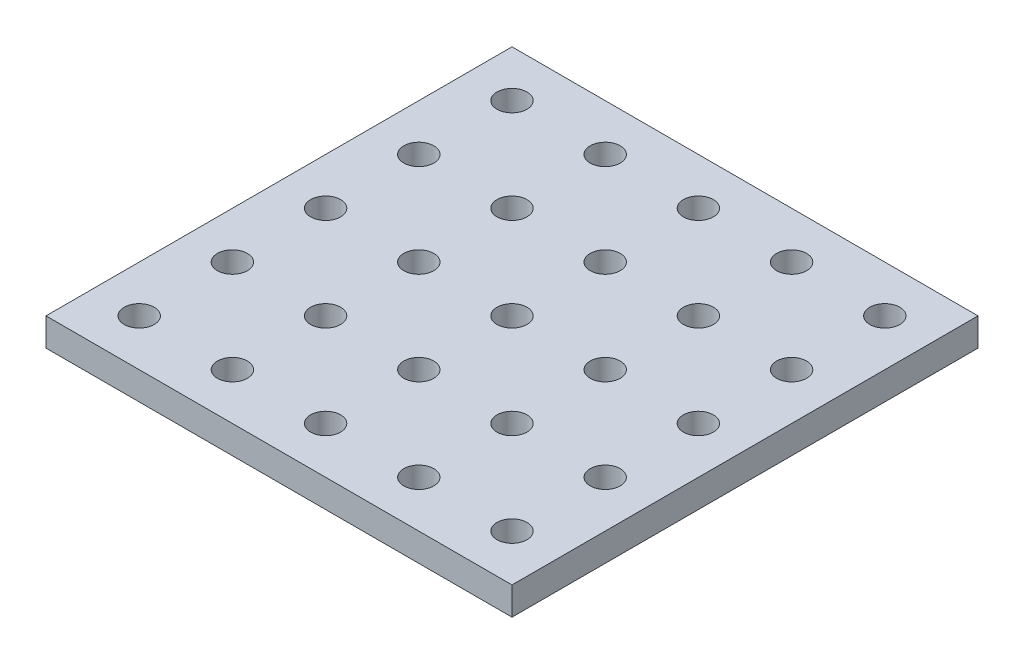
ISO-10303-21;
HEADER;
FILE_DESCRIPTION(('STEP AP214'),'2;1');
FILE_NAME('part.step','',(''),(''),'','','');
FILE_SCHEMA(('AUTOMOTIVE_DESIGN { 1 0 10303 214 1 1 1 1 }'));
ENDSEC;
DATA;
#1=APPLICATION_CONTEXT('core data for automotive mechanical design processes');
#2=APPLICATION_PROTOCOL_DEFINITION('international standard','automotive_design',2000,#1);
#3=PRODUCT_CONTEXT('',#1,'mechanical');
#4=PRODUCT('Part','Part','',(#3));
#5=PRODUCT_RELATED_PRODUCT_CATEGORY('part','',(#4));
#6=PRODUCT_DEFINITION_FORMATION('','',#4);
#7=PRODUCT_DEFINITION_CONTEXT('part definition',#1,'design');
#8=PRODUCT_DEFINITION('design','',#6,#7);
#9=PRODUCT_DEFINITION_SHAPE('','',#8);
#10=(LENGTH_UNIT() NAMED_UNIT(*) SI_UNIT(.MILLI.,.METRE.));
#11=(NAMED_UNIT(*) PLANE_ANGLE_UNIT() SI_UNIT($,.RADIAN.));
#12=(NAMED_UNIT(*) SI_UNIT($,.STERADIAN.) SOLID_ANGLE_UNIT());
#13=UNCERTAINTY_MEASURE_WITH_UNIT(LENGTH_MEASURE(1.E-05),#10,'distance_accuracy_value','');
#14=(GEOMETRIC_REPRESENTATION_CONTEXT(3) GLOBAL_UNCERTAINTY_ASSIGNED_CONTEXT((#13)) GLOBAL_UNIT_ASSIGNED_CONTEXT((#10,
#11,#12)) REPRESENTATION_CONTEXT('',''));
#15=CARTESIAN_POINT('',(0.,0.,0.));
#16=DIRECTION('',(0.,0.,1.));
#17=DIRECTION('',(1.,0.,0.));
#18=AXIS2_PLACEMENT_3D('',#15,#16,#17);
#19=CARTESIAN_POINT('',(-125.,15.,-125.));
#20=DIRECTION('',(1.,0.,0.));
#21=DIRECTION('',(0.,0.,-1.));
#22=AXIS2_PLACEMENT_3D('',#19,#20,#21);
#23=PLANE('',#22);
#24=DIRECTION('',(0.,0.,1.));
#25=VECTOR('',#24,1.);
#26=CARTESIAN_POINT('',(-125.,0.,-125.));
#27=LINE('',#26,#25);
#28=CARTESIAN_POINT('',(-125.,0.,-125.));
#29=VERTEX_POINT('',#28);
#30=CARTESIAN_POINT('',(-125.,0.,125.));
#31=VERTEX_POINT('',#30);
#32=EDGE_CURVE('E107',#29,#31,#27,.T.);
#33=ORIENTED_EDGE('',*,*,#32,.T.);
#34=DIRECTION('',(0.,-1.,0.));
#35=VECTOR('',#34,1.);
#36=CARTESIAN_POINT('',(-125.,15.,125.));
#37=LINE('',#36,#35);
#38=CARTESIAN_POINT('',(-125.,15.,125.));
#39=VERTEX_POINT('',#38);
#40=EDGE_CURVE('E11',#39,#31,#37,.T.);
#41=ORIENTED_EDGE('',*,*,#40,.F.);
#42=DIRECTION('',(0.,0.,1.));
#43=VECTOR('',#42,1.);
#44=CARTESIAN_POINT('',(-125.,15.,-125.));
#45=LINE('',#44,#43);
#46=CARTESIAN_POINT('',(-125.,15.,-125.));
#47=VERTEX_POINT('',#46);
#48=EDGE_CURVE('E91',#47,#39,#45,.T.);
#49=ORIENTED_EDGE('',*,*,#48,.F.);
#50=DIRECTION('',(0.,-1.,0.));
#51=VECTOR('',#50,1.);
#52=CARTESIAN_POINT('',(-125.,15.,-125.));
#53=LINE('',#52,#51);
#54=EDGE_CURVE('E103',#47,#29,#53,.T.);
#55=ORIENTED_EDGE('',*,*,#54,.T.);
#56=EDGE_LOOP('',(#33,#41,#49,#55));
#57=FACE_BOUND('',#56,.T.);
#58=ADVANCED_FACE('F39',(#57),#23,.F.);
#59=CARTESIAN_POINT('',(-125.,15.,125.));
#60=DIRECTION('',(0.,0.,-1.));
#61=DIRECTION('',(-1.,0.,0.));
#62=AXIS2_PLACEMENT_3D('',#59,#60,#61);
#63=PLANE('',#62);
#64=DIRECTION('',(1.,0.,0.));
#65=VECTOR('',#64,1.);
#66=CARTESIAN_POINT('',(-125.,0.,125.));
#67=LINE('',#66,#65);
#68=CARTESIAN_POINT('',(125.,0.,125.));
#69=VERTEX_POINT('',#68);
#70=EDGE_CURVE('E96',#31,#69,#67,.T.);
#71=ORIENTED_EDGE('',*,*,#70,.T.);
#72=DIRECTION('',(0.,-1.,0.));
#73=VECTOR('',#72,1.);
#74=CARTESIAN_POINT('',(125.,15.,125.));
#75=LINE('',#74,#73);
#76=CARTESIAN_POINT('',(125.,15.,125.));
#77=VERTEX_POINT('',#76);
#78=EDGE_CURVE('E48',#77,#69,#75,.T.);
#79=ORIENTED_EDGE('',*,*,#78,.F.);
#80=DIRECTION('',(1.,0.,0.));
#81=VECTOR('',#80,1.);
#82=CARTESIAN_POINT('',(-125.,15.,125.));
#83=LINE('',#82,#81);
#84=EDGE_CURVE('E86',#39,#77,#83,.T.);
#85=ORIENTED_EDGE('',*,*,#84,.F.);
#86=ORIENTED_EDGE('',*,*,#40,.T.);
#87=EDGE_LOOP('',(#71,#79,#85,#86));
#88=FACE_BOUND('',#87,.T.);
#89=ADVANCED_FACE('F95',(#88),#63,.F.);
#90=CARTESIAN_POINT('',(125.,15.,-125.));
#91=DIRECTION('',(-1.,0.,0.));
#92=DIRECTION('',(0.,0.,1.));
#93=AXIS2_PLACEMENT_3D('',#90,#91,#92);
#94=PLANE('',#93);
#95=DIRECTION('',(0.,0.,-1.));
#96=VECTOR('',#95,1.);
#97=CARTESIAN_POINT('',(125.,0.,-125.));
#98=LINE('',#97,#96);
#99=CARTESIAN_POINT('',(125.,0.,-125.));
#100=VERTEX_POINT('',#99);
#101=EDGE_CURVE('E73',#69,#100,#98,.T.);
#102=ORIENTED_EDGE('',*,*,#101,.T.);
#103=DIRECTION('',(0.,-1.,0.));
#104=VECTOR('',#103,1.);
#105=CARTESIAN_POINT('',(125.,15.,-125.));
#106=LINE('',#105,#104);
#107=CARTESIAN_POINT('',(125.,15.,-125.));
#108=VERTEX_POINT('',#107);
#109=EDGE_CURVE('E98',#108,#100,#106,.T.);
#110=ORIENTED_EDGE('',*,*,#109,.F.);
#111=DIRECTION('',(0.,0.,-1.));
#112=VECTOR('',#111,1.);
#113=CARTESIAN_POINT('',(125.,15.,-125.));
#114=LINE('',#113,#112);
#115=EDGE_CURVE('E89',#77,#108,#114,.T.);
#116=ORIENTED_EDGE('',*,*,#115,.F.);
#117=ORIENTED_EDGE('',*,*,#78,.T.);
#118=EDGE_LOOP('',(#102,#110,#116,#117));
#119=FACE_BOUND('',#118,.T.);
#120=ADVANCED_FACE('F99',(#119),#94,.F.);
#121=CARTESIAN_POINT('',(-125.,15.,-125.));
#122=DIRECTION('',(0.,0.,1.));
#123=DIRECTION('',(1.,0.,0.));
#124=AXIS2_PLACEMENT_3D('',#121,#122,#123);
#125=PLANE('',#124);
#126=DIRECTION('',(-1.,0.,0.));
#127=VECTOR('',#126,1.);
#128=CARTESIAN_POINT('',(-125.,0.,-125.));
#129=LINE('',#128,#127);
#130=EDGE_CURVE('E79',#100,#29,#129,.T.);
#131=ORIENTED_EDGE('',*,*,#130,.T.);
#132=ORIENTED_EDGE('',*,*,#54,.F.);
#133=DIRECTION('',(-1.,0.,0.));
#134=VECTOR('',#133,1.);
#135=CARTESIAN_POINT('',(-125.,15.,-125.));
#136=LINE('',#135,#134);
#137=EDGE_CURVE('E56',#108,#47,#136,.T.);
#138=ORIENTED_EDGE('',*,*,#137,.F.);
#139=ORIENTED_EDGE('',*,*,#109,.T.);
#140=EDGE_LOOP('',(#131,#132,#138,#139));
#141=FACE_BOUND('',#140,.T.);
#142=ADVANCED_FACE('F121',(#141),#125,.F.);
#143=CARTESIAN_POINT('',(0.,15.,0.));
#144=DIRECTION('',(0.,1.,0.));
#145=DIRECTION('',(0.,0.,1.));
#146=AXIS2_PLACEMENT_3D('',#143,#144,#145);
#147=PLANE('',#146);
#148=CARTESIAN_POINT('',(-50.,15.,-100.));
#149=DIRECTION('',(0.,1.,0.));
#150=DIRECTION('',(0.,0.,1.));
#151=AXIS2_PLACEMENT_3D('',#148,#149,#150);
#152=CIRCLE('',#151,8.05);
#153=CARTESIAN_POINT('',(-50.,15.,-91.95));
#154=VERTEX_POINT('',#153);
#155=EDGE_CURVE('E257',#154,#154,#152,.T.);
#156=ORIENTED_EDGE('',*,*,#155,.F.);
#157=EDGE_LOOP('',(#156));
#158=FACE_BOUND('',#157,.T.);
#159=CARTESIAN_POINT('',(0.,15.,-100.));
#160=DIRECTION('',(0.,1.,0.));
#161=DIRECTION('',(0.,0.,1.));
#162=AXIS2_PLACEMENT_3D('',#159,#160,#161);
#163=CIRCLE('',#162,8.05);
#164=CARTESIAN_POINT('',(0.,15.,-91.95));
#165=VERTEX_POINT('',#164);
#166=EDGE_CURVE('E249',#165,#165,#163,.T.);
#167=ORIENTED_EDGE('',*,*,#166,.F.);
#168=EDGE_LOOP('',(#167));
#169=FACE_BOUND('',#168,.T.);
#170=CARTESIAN_POINT('',(50.,15.,-100.));
#171=DIRECTION('',(0.,1.,0.));
#172=DIRECTION('',(0.,0.,1.));
#173=AXIS2_PLACEMENT_3D('',#170,#171,#172);
#174=CIRCLE('',#173,8.05);
#175=CARTESIAN_POINT('',(50.,15.,-91.95));
#176=VERTEX_POINT('',#175);
#177=EDGE_CURVE('E241',#176,#176,#174,.T.);
#178=ORIENTED_EDGE('',*,*,#177,.F.);
#179=EDGE_LOOP('',(#178));
#180=FACE_BOUND('',#179,.T.);
#181=CARTESIAN_POINT('',(100.,15.,-100.));
#182=DIRECTION('',(0.,1.,0.));
#183=DIRECTION('',(0.,0.,1.));
#184=AXIS2_PLACEMENT_3D('',#181,#182,#183);
#185=CIRCLE('',#184,8.05000000000001);
#186=CARTESIAN_POINT('',(100.,15.,-91.95));
#187=VERTEX_POINT('',#186);
#188=EDGE_CURVE('E233',#187,#187,#185,.T.);
#189=ORIENTED_EDGE('',*,*,#188,.F.);
#190=EDGE_LOOP('',(#189));
#191=FACE_BOUND('',#190,.T.);
#192=CARTESIAN_POINT('',(-49.9999999999995,15.,-50.));
#193=DIRECTION('',(0.,1.,0.));
#194=DIRECTION('',(0.,0.,1.));
#195=AXIS2_PLACEMENT_3D('',#192,#193,#194);
#196=CIRCLE('',#195,8.05);
#197=CARTESIAN_POINT('',(-49.9999999999995,15.,-41.95));
#198=VERTEX_POINT('',#197);
#199=EDGE_CURVE('E225',#198,#198,#196,.T.);
#200=ORIENTED_EDGE('',*,*,#199,.F.);
#201=EDGE_LOOP('',(#200));
#202=FACE_BOUND('',#201,.T.);
#203=CARTESIAN_POINT('',(5.55111512312578E-13,15.,-50.));
#204=DIRECTION('',(0.,1.,0.));
#205=DIRECTION('',(0.,0.,1.));
#206=AXIS2_PLACEMENT_3D('',#203,#204,#205);
#207=CIRCLE('',#206,8.05);
#208=CARTESIAN_POINT('',(5.55111512312578E-13,15.,-41.95));
#209=VERTEX_POINT('',#208);
#210=EDGE_CURVE('E217',#209,#209,#207,.T.);
#211=ORIENTED_EDGE('',*,*,#210,.F.);
#212=EDGE_LOOP('',(#211));
#213=FACE_BOUND('',#212,.T.);
#214=CARTESIAN_POINT('',(50.0000000000006,15.,-50.));
#215=DIRECTION('',(0.,1.,0.));
#216=DIRECTION('',(0.,0.,1.));
#217=AXIS2_PLACEMENT_3D('',#214,#215,#216);
#218=CIRCLE('',#217,8.05);
#219=CARTESIAN_POINT('',(50.0000000000006,15.,-41.95));
#220=VERTEX_POINT('',#219);
#221=EDGE_CURVE('E209',#220,#220,#218,.T.);
#222=ORIENTED_EDGE('',*,*,#221,.F.);
#223=EDGE_LOOP('',(#222));
#224=FACE_BOUND('',#223,.T.);
#225=CARTESIAN_POINT('',(100.000000000001,15.,-50.));
#226=DIRECTION('',(0.,1.,0.));
#227=DIRECTION('',(0.,0.,1.));
#228=AXIS2_PLACEMENT_3D('',#225,#226,#227);
#229=CIRCLE('',#228,8.05000000000001);
#230=CARTESIAN_POINT('',(100.000000000001,15.,-41.95));
#231=VERTEX_POINT('',#230);
#232=EDGE_CURVE('E201',#231,#231,#229,.T.);
#233=ORIENTED_EDGE('',*,*,#232,.F.);
#234=EDGE_LOOP('',(#233));
#235=FACE_BOUND('',#234,.T.);
#236=CARTESIAN_POINT('',(-49.9999999999989,15.,0.));
#237=DIRECTION('',(0.,1.,0.));
#238=DIRECTION('',(0.,0.,1.));
#239=AXIS2_PLACEMENT_3D('',#236,#237,#238);
#240=CIRCLE('',#239,8.05);
#241=CARTESIAN_POINT('',(-49.9999999999989,15.,8.05));
#242=VERTEX_POINT('',#241);
#243=EDGE_CURVE('E193',#242,#242,#240,.T.);
#244=ORIENTED_EDGE('',*,*,#243,.F.);
#245=EDGE_LOOP('',(#244));
#246=FACE_BOUND('',#245,.T.);
#247=CARTESIAN_POINT('',(1.06858966120171E-12,15.,0.));
#248=DIRECTION('',(0.,1.,0.));
#249=DIRECTION('',(0.,0.,1.));
#250=AXIS2_PLACEMENT_3D('',#247,#248,#249);
#251=CIRCLE('',#250,8.05);
#252=CARTESIAN_POINT('',(1.06858966120171E-12,15.,8.05));
#253=VERTEX_POINT('',#252);
#254=EDGE_CURVE('E185',#253,#253,#251,.T.);
#255=ORIENTED_EDGE('',*,*,#254,.F.);
#256=EDGE_LOOP('',(#255));
#257=FACE_BOUND('',#256,.T.);
#258=CARTESIAN_POINT('',(50.0000000000011,15.,0.));
#259=DIRECTION('',(0.,1.,0.));
#260=DIRECTION('',(0.,0.,1.));
#261=AXIS2_PLACEMENT_3D('',#258,#259,#260);
#262=CIRCLE('',#261,8.05);
#263=CARTESIAN_POINT('',(50.0000000000011,15.,8.05));
#264=VERTEX_POINT('',#263);
#265=EDGE_CURVE('E177',#264,#264,#262,.T.);
#266=ORIENTED_EDGE('',*,*,#265,.F.);
#267=EDGE_LOOP('',(#266));
#268=FACE_BOUND('',#267,.T.);
#269=CARTESIAN_POINT('',(100.000000000001,15.,0.));
#270=DIRECTION('',(0.,1.,0.));
#271=DIRECTION('',(0.,0.,1.));
#272=AXIS2_PLACEMENT_3D('',#269,#270,#271);
#273=CIRCLE('',#272,8.05000000000001);
#274=CARTESIAN_POINT('',(100.000000000001,15.,8.05000000000001));
#275=VERTEX_POINT('',#274);
#276=EDGE_CURVE('E169',#275,#275,#273,.T.);
#277=ORIENTED_EDGE('',*,*,#276,.F.);
#278=EDGE_LOOP('',(#277));
#279=FACE_BOUND('',#278,.T.);
#280=CARTESIAN_POINT('',(-49.9999999999984,15.,50.));
#281=DIRECTION('',(0.,1.,0.));
#282=DIRECTION('',(0.,0.,1.));
#283=AXIS2_PLACEMENT_3D('',#280,#281,#282);
#284=CIRCLE('',#283,8.05);
#285=CARTESIAN_POINT('',(-49.9999999999984,15.,58.05));
#286=VERTEX_POINT('',#285);
#287=EDGE_CURVE('E161',#286,#286,#284,.T.);
#288=ORIENTED_EDGE('',*,*,#287,.F.);
#289=EDGE_LOOP('',(#288));
#290=FACE_BOUND('',#289,.T.);
#291=CARTESIAN_POINT('',(1.59594559789866E-12,15.,50.));
#292=DIRECTION('',(0.,1.,0.));
#293=DIRECTION('',(0.,0.,1.));
#294=AXIS2_PLACEMENT_3D('',#291,#292,#293);
#295=CIRCLE('',#294,8.05);
#296=CARTESIAN_POINT('',(1.59594559789866E-12,15.,58.05));
#297=VERTEX_POINT('',#296);
#298=EDGE_CURVE('E153',#297,#297,#295,.T.);
#299=ORIENTED_EDGE('',*,*,#298,.F.);
#300=EDGE_LOOP('',(#299));
#301=FACE_BOUND('',#300,.T.);
#302=CARTESIAN_POINT('',(50.0000000000016,15.,50.));
#303=DIRECTION('',(0.,1.,0.));
#304=DIRECTION('',(0.,0.,1.));
#305=AXIS2_PLACEMENT_3D('',#302,#303,#304);
#306=CIRCLE('',#305,8.05);
#307=CARTESIAN_POINT('',(50.0000000000016,15.,58.05));
#308=VERTEX_POINT('',#307);
#309=EDGE_CURVE('E145',#308,#308,#306,.T.);
#310=ORIENTED_EDGE('',*,*,#309,.F.);
#311=EDGE_LOOP('',(#310));
#312=FACE_BOUND('',#311,.T.);
#313=CARTESIAN_POINT('',(100.000000000002,15.,50.));
#314=DIRECTION('',(0.,1.,0.));
#315=DIRECTION('',(0.,0.,1.));
#316=AXIS2_PLACEMENT_3D('',#313,#314,#315);
#317=CIRCLE('',#316,8.05000000000001);
#318=CARTESIAN_POINT('',(100.000000000002,15.,58.05));
#319=VERTEX_POINT('',#318);
#320=EDGE_CURVE('E136',#319,#319,#317,.T.);
#321=ORIENTED_EDGE('',*,*,#320,.F.);
#322=EDGE_LOOP('',(#321));
#323=FACE_BOUND('',#322,.T.);
#324=CARTESIAN_POINT('',(-49.9999999999979,15.,100.));
#325=DIRECTION('',(0.,1.,0.));
#326=DIRECTION('',(0.,0.,1.));
#327=AXIS2_PLACEMENT_3D('',#324,#325,#326);
#328=CIRCLE('',#327,8.05);
#329=CARTESIAN_POINT('',(-49.9999999999979,15.,108.05));
#330=VERTEX_POINT('',#329);
#331=EDGE_CURVE('E320',#330,#330,#328,.T.);
#332=ORIENTED_EDGE('',*,*,#331,.F.);
#333=EDGE_LOOP('',(#332));
#334=FACE_BOUND('',#333,.T.);
#335=CARTESIAN_POINT('',(2.1094237467878E-12,15.,100.));
#336=DIRECTION('',(0.,1.,0.));
#337=DIRECTION('',(0.,0.,1.));
#338=AXIS2_PLACEMENT_3D('',#335,#336,#337);
#339=CIRCLE('',#338,8.05);
#340=CARTESIAN_POINT('',(2.1094237467878E-12,15.,108.05));
#341=VERTEX_POINT('',#340);
#342=EDGE_CURVE('E312',#341,#341,#339,.T.);
#343=ORIENTED_EDGE('',*,*,#342,.F.);
#344=EDGE_LOOP('',(#343));
#345=FACE_BOUND('',#344,.T.);
#346=CARTESIAN_POINT('',(50.0000000000021,15.,100.));
#347=DIRECTION('',(0.,1.,0.));
#348=DIRECTION('',(0.,0.,1.));
#349=AXIS2_PLACEMENT_3D('',#346,#347,#348);
#350=CIRCLE('',#349,8.05);
#351=CARTESIAN_POINT('',(50.0000000000021,15.,108.05));
#352=VERTEX_POINT('',#351);
#353=EDGE_CURVE('E304',#352,#352,#350,.T.);
#354=ORIENTED_EDGE('',*,*,#353,.F.);
#355=EDGE_LOOP('',(#354));
#356=FACE_BOUND('',#355,.T.);
#357=CARTESIAN_POINT('',(100.000000000002,15.,100.));
#358=DIRECTION('',(0.,1.,0.));
#359=DIRECTION('',(0.,0.,1.));
#360=AXIS2_PLACEMENT_3D('',#357,#358,#359);
#361=CIRCLE('',#360,8.05000000000001);
#362=CARTESIAN_POINT('',(100.000000000002,15.,108.05));
#363=VERTEX_POINT('',#362);
#364=EDGE_CURVE('E296',#363,#363,#361,.T.);
#365=ORIENTED_EDGE('',*,*,#364,.F.);
#366=EDGE_LOOP('',(#365));
#367=FACE_BOUND('',#366,.T.);
#368=CARTESIAN_POINT('',(-99.9999999999994,15.,-50.));
#369=DIRECTION('',(0.,1.,0.));
#370=DIRECTION('',(0.,0.,1.));
#371=AXIS2_PLACEMENT_3D('',#368,#369,#370);
#372=CIRCLE('',#371,8.05000000000001);
#373=CARTESIAN_POINT('',(-99.9999999999994,15.,-41.95));
#374=VERTEX_POINT('',#373);
#375=EDGE_CURVE('E288',#374,#374,#372,.T.);
#376=ORIENTED_EDGE('',*,*,#375,.F.);
#377=EDGE_LOOP('',(#376));
#378=FACE_BOUND('',#377,.T.);
#379=CARTESIAN_POINT('',(-99.9999999999989,15.,0.));
#380=DIRECTION('',(0.,1.,0.));
#381=DIRECTION('',(0.,0.,1.));
#382=AXIS2_PLACEMENT_3D('',#379,#380,#381);
#383=CIRCLE('',#382,8.05);
#384=CARTESIAN_POINT('',(-99.9999999999989,15.,8.05));
#385=VERTEX_POINT('',#384);
#386=EDGE_CURVE('E280',#385,#385,#383,.T.);
#387=ORIENTED_EDGE('',*,*,#386,.F.);
#388=EDGE_LOOP('',(#387));
#389=FACE_BOUND('',#388,.T.);
#390=CARTESIAN_POINT('',(-99.9999999999984,15.,50.));
#391=DIRECTION('',(0.,1.,0.));
#392=DIRECTION('',(0.,0.,1.));
#393=AXIS2_PLACEMENT_3D('',#390,#391,#392);
#394=CIRCLE('',#393,8.05);
#395=CARTESIAN_POINT('',(-99.9999999999984,15.,58.05));
#396=VERTEX_POINT('',#395);
#397=EDGE_CURVE('E272',#396,#396,#394,.T.);
#398=ORIENTED_EDGE('',*,*,#397,.F.);
#399=EDGE_LOOP('',(#398));
#400=FACE_BOUND('',#399,.T.);
#401=CARTESIAN_POINT('',(-99.9999999999979,15.,100.));
#402=DIRECTION('',(0.,1.,0.));
#403=DIRECTION('',(0.,0.,1.));
#404=AXIS2_PLACEMENT_3D('',#401,#402,#403);
#405=CIRCLE('',#404,8.05000000000001);
#406=CARTESIAN_POINT('',(-99.9999999999979,15.,108.05));
#407=VERTEX_POINT('',#406);
#408=EDGE_CURVE('E264',#407,#407,#405,.T.);
#409=ORIENTED_EDGE('',*,*,#408,.F.);
#410=EDGE_LOOP('',(#409));
#411=FACE_BOUND('',#410,.T.);
#412=CARTESIAN_POINT('',(-100.,15.,-100.));
#413=DIRECTION('',(0.,1.,0.));
#414=DIRECTION('',(0.,0.,1.));
#415=AXIS2_PLACEMENT_3D('',#412,#413,#414);
#416=CIRCLE('',#415,8.05000000000001);
#417=CARTESIAN_POINT('',(-100.,15.,-91.95));
#418=VERTEX_POINT('',#417);
#419=EDGE_CURVE('E128',#418,#418,#416,.T.);
#420=ORIENTED_EDGE('',*,*,#419,.F.);
#421=EDGE_LOOP('',(#420));
#422=FACE_BOUND('',#421,.T.);
#423=ORIENTED_EDGE('',*,*,#48,.T.);
#424=ORIENTED_EDGE('',*,*,#84,.T.);
#425=ORIENTED_EDGE('',*,*,#115,.T.);
#426=ORIENTED_EDGE('',*,*,#137,.T.);
#427=EDGE_LOOP('',(#423,#424,#425,#426));
#428=FACE_BOUND('',#427,.T.);
#429=ADVANCED_FACE('F87',(#158,#169,#180,#191,#202,#213,#224,#235,#246,#257,#268,#279,#290,#301,
#312,#323,#334,#345,#356,#367,#378,#389,#400,#411,#422,#428),#147,.T.);
#430=CARTESIAN_POINT('',(0.,0.,0.));
#431=DIRECTION('',(0.,1.,0.));
#432=DIRECTION('',(0.,0.,1.));
#433=AXIS2_PLACEMENT_3D('',#430,#431,#432);
#434=PLANE('',#433);
#435=CARTESIAN_POINT('',(-50.,0.,-100.));
#436=DIRECTION('',(0.,1.,0.));
#437=DIRECTION('',(0.,0.,1.));
#438=AXIS2_PLACEMENT_3D('',#435,#436,#437);
#439=CIRCLE('',#438,8.05);
#440=CARTESIAN_POINT('',(-50.,0.,-91.95));
#441=VERTEX_POINT('',#440);
#442=EDGE_CURVE('E132',#441,#441,#439,.T.);
#443=ORIENTED_EDGE('',*,*,#442,.T.);
#444=EDGE_LOOP('',(#443));
#445=FACE_BOUND('',#444,.T.);
#446=CARTESIAN_POINT('',(0.,0.,-100.));
#447=DIRECTION('',(0.,1.,0.));
#448=DIRECTION('',(0.,0.,1.));
#449=AXIS2_PLACEMENT_3D('',#446,#447,#448);
#450=CIRCLE('',#449,8.05);
#451=CARTESIAN_POINT('',(0.,0.,-91.95));
#452=VERTEX_POINT('',#451);
#453=EDGE_CURVE('E253',#452,#452,#450,.T.);
#454=ORIENTED_EDGE('',*,*,#453,.T.);
#455=EDGE_LOOP('',(#454));
#456=FACE_BOUND('',#455,.T.);
#457=CARTESIAN_POINT('',(50.,0.,-100.));
#458=DIRECTION('',(0.,1.,0.));
#459=DIRECTION('',(0.,0.,1.));
#460=AXIS2_PLACEMENT_3D('',#457,#458,#459);
#461=CIRCLE('',#460,8.05);
#462=CARTESIAN_POINT('',(50.,0.,-91.95));
#463=VERTEX_POINT('',#462);
#464=EDGE_CURVE('E245',#463,#463,#461,.T.);
#465=ORIENTED_EDGE('',*,*,#464,.T.);
#466=EDGE_LOOP('',(#465));
#467=FACE_BOUND('',#466,.T.);
#468=CARTESIAN_POINT('',(100.,0.,-100.));
#469=DIRECTION('',(0.,1.,0.));
#470=DIRECTION('',(0.,0.,1.));
#471=AXIS2_PLACEMENT_3D('',#468,#469,#470);
#472=CIRCLE('',#471,8.05000000000001);
#473=CARTESIAN_POINT('',(100.,0.,-91.95));
#474=VERTEX_POINT('',#473);
#475=EDGE_CURVE('E237',#474,#474,#472,.T.);
#476=ORIENTED_EDGE('',*,*,#475,.T.);
#477=EDGE_LOOP('',(#476));
#478=FACE_BOUND('',#477,.T.);
#479=CARTESIAN_POINT('',(-49.9999999999995,0.,-50.));
#480=DIRECTION('',(0.,1.,0.));
#481=DIRECTION('',(0.,0.,1.));
#482=AXIS2_PLACEMENT_3D('',#479,#480,#481);
#483=CIRCLE('',#482,8.05);
#484=CARTESIAN_POINT('',(-49.9999999999995,0.,-41.95));
#485=VERTEX_POINT('',#484);
#486=EDGE_CURVE('E229',#485,#485,#483,.T.);
#487=ORIENTED_EDGE('',*,*,#486,.T.);
#488=EDGE_LOOP('',(#487));
#489=FACE_BOUND('',#488,.T.);
#490=CARTESIAN_POINT('',(5.55111512312578E-13,0.,-50.));
#491=DIRECTION('',(0.,1.,0.));
#492=DIRECTION('',(0.,0.,1.));
#493=AXIS2_PLACEMENT_3D('',#490,#491,#492);
#494=CIRCLE('',#493,8.05);
#495=CARTESIAN_POINT('',(5.55111512312578E-13,0.,-41.95));
#496=VERTEX_POINT('',#495);
#497=EDGE_CURVE('E221',#496,#496,#494,.T.);
#498=ORIENTED_EDGE('',*,*,#497,.T.);
#499=EDGE_LOOP('',(#498));
#500=FACE_BOUND('',#499,.T.);
#501=CARTESIAN_POINT('',(50.0000000000006,0.,-50.));
#502=DIRECTION('',(0.,1.,0.));
#503=DIRECTION('',(0.,0.,1.));
#504=AXIS2_PLACEMENT_3D('',#501,#502,#503);
#505=CIRCLE('',#504,8.05);
#506=CARTESIAN_POINT('',(50.0000000000006,0.,-41.95));
#507=VERTEX_POINT('',#506);
#508=EDGE_CURVE('E213',#507,#507,#505,.T.);
#509=ORIENTED_EDGE('',*,*,#508,.T.);
#510=EDGE_LOOP('',(#509));
#511=FACE_BOUND('',#510,.T.);
#512=CARTESIAN_POINT('',(100.000000000001,0.,-50.));
#513=DIRECTION('',(0.,1.,0.));
#514=DIRECTION('',(0.,0.,1.));
#515=AXIS2_PLACEMENT_3D('',#512,#513,#514);
#516=CIRCLE('',#515,8.05000000000001);
#517=CARTESIAN_POINT('',(100.000000000001,0.,-41.95));
#518=VERTEX_POINT('',#517);
#519=EDGE_CURVE('E205',#518,#518,#516,.T.);
#520=ORIENTED_EDGE('',*,*,#519,.T.);
#521=EDGE_LOOP('',(#520));
#522=FACE_BOUND('',#521,.T.);
#523=CARTESIAN_POINT('',(-49.9999999999989,0.,0.));
#524=DIRECTION('',(0.,1.,0.));
#525=DIRECTION('',(0.,0.,1.));
#526=AXIS2_PLACEMENT_3D('',#523,#524,#525);
#527=CIRCLE('',#526,8.05);
#528=CARTESIAN_POINT('',(-49.9999999999989,0.,8.05));
#529=VERTEX_POINT('',#528);
#530=EDGE_CURVE('E197',#529,#529,#527,.T.);
#531=ORIENTED_EDGE('',*,*,#530,.T.);
#532=EDGE_LOOP('',(#531));
#533=FACE_BOUND('',#532,.T.);
#534=CARTESIAN_POINT('',(1.06858966120171E-12,0.,0.));
#535=DIRECTION('',(0.,1.,0.));
#536=DIRECTION('',(0.,0.,1.));
#537=AXIS2_PLACEMENT_3D('',#534,#535,#536);
#538=CIRCLE('',#537,8.05);
#539=CARTESIAN_POINT('',(1.06858966120171E-12,0.,8.05));
#540=VERTEX_POINT('',#539);
#541=EDGE_CURVE('E189',#540,#540,#538,.T.);
#542=ORIENTED_EDGE('',*,*,#541,.T.);
#543=EDGE_LOOP('',(#542));
#544=FACE_BOUND('',#543,.T.);
#545=CARTESIAN_POINT('',(50.0000000000011,0.,0.));
#546=DIRECTION('',(0.,1.,0.));
#547=DIRECTION('',(0.,0.,1.));
#548=AXIS2_PLACEMENT_3D('',#545,#546,#547);
#549=CIRCLE('',#548,8.05);
#550=CARTESIAN_POINT('',(50.0000000000011,0.,8.05));
#551=VERTEX_POINT('',#550);
#552=EDGE_CURVE('E181',#551,#551,#549,.T.);
#553=ORIENTED_EDGE('',*,*,#552,.T.);
#554=EDGE_LOOP('',(#553));
#555=FACE_BOUND('',#554,.T.);
#556=CARTESIAN_POINT('',(100.000000000001,0.,0.));
#557=DIRECTION('',(0.,1.,0.));
#558=DIRECTION('',(0.,0.,1.));
#559=AXIS2_PLACEMENT_3D('',#556,#557,#558);
#560=CIRCLE('',#559,8.05000000000001);
#561=CARTESIAN_POINT('',(100.000000000001,0.,8.05000000000001));
#562=VERTEX_POINT('',#561);
#563=EDGE_CURVE('E173',#562,#562,#560,.T.);
#564=ORIENTED_EDGE('',*,*,#563,.T.);
#565=EDGE_LOOP('',(#564));
#566=FACE_BOUND('',#565,.T.);
#567=CARTESIAN_POINT('',(-49.9999999999984,0.,50.));
#568=DIRECTION('',(0.,1.,0.));
#569=DIRECTION('',(0.,0.,1.));
#570=AXIS2_PLACEMENT_3D('',#567,#568,#569);
#571=CIRCLE('',#570,8.05);
#572=CARTESIAN_POINT('',(-49.9999999999984,0.,58.05));
#573=VERTEX_POINT('',#572);
#574=EDGE_CURVE('E165',#573,#573,#571,.T.);
#575=ORIENTED_EDGE('',*,*,#574,.T.);
#576=EDGE_LOOP('',(#575));
#577=FACE_BOUND('',#576,.T.);
#578=CARTESIAN_POINT('',(1.59594559789866E-12,0.,50.));
#579=DIRECTION('',(0.,1.,0.));
#580=DIRECTION('',(0.,0.,1.));
#581=AXIS2_PLACEMENT_3D('',#578,#579,#580);
#582=CIRCLE('',#581,8.05);
#583=CARTESIAN_POINT('',(1.59594559789866E-12,0.,58.05));
#584=VERTEX_POINT('',#583);
#585=EDGE_CURVE('E157',#584,#584,#582,.T.);
#586=ORIENTED_EDGE('',*,*,#585,.T.);
#587=EDGE_LOOP('',(#586));
#588=FACE_BOUND('',#587,.T.);
#589=CARTESIAN_POINT('',(50.0000000000016,0.,50.));
#590=DIRECTION('',(0.,1.,0.));
#591=DIRECTION('',(0.,0.,1.));
#592=AXIS2_PLACEMENT_3D('',#589,#590,#591);
#593=CIRCLE('',#592,8.05);
#594=CARTESIAN_POINT('',(50.0000000000016,0.,58.05));
#595=VERTEX_POINT('',#594);
#596=EDGE_CURVE('E149',#595,#595,#593,.T.);
#597=ORIENTED_EDGE('',*,*,#596,.T.);
#598=EDGE_LOOP('',(#597));
#599=FACE_BOUND('',#598,.T.);
#600=CARTESIAN_POINT('',(100.000000000002,0.,50.));
#601=DIRECTION('',(0.,1.,0.));
#602=DIRECTION('',(0.,0.,1.));
#603=AXIS2_PLACEMENT_3D('',#600,#601,#602);
#604=CIRCLE('',#603,8.05000000000001);
#605=CARTESIAN_POINT('',(100.000000000002,0.,58.05));
#606=VERTEX_POINT('',#605);
#607=EDGE_CURVE('E140',#606,#606,#604,.T.);
#608=ORIENTED_EDGE('',*,*,#607,.T.);
#609=EDGE_LOOP('',(#608));
#610=FACE_BOUND('',#609,.T.);
#611=CARTESIAN_POINT('',(-49.9999999999979,0.,100.));
#612=DIRECTION('',(0.,1.,0.));
#613=DIRECTION('',(0.,0.,1.));
#614=AXIS2_PLACEMENT_3D('',#611,#612,#613);
#615=CIRCLE('',#614,8.05);
#616=CARTESIAN_POINT('',(-49.9999999999979,0.,108.05));
#617=VERTEX_POINT('',#616);
#618=EDGE_CURVE('E141',#617,#617,#615,.T.);
#619=ORIENTED_EDGE('',*,*,#618,.T.);
#620=EDGE_LOOP('',(#619));
#621=FACE_BOUND('',#620,.T.);
#622=CARTESIAN_POINT('',(2.1094237467878E-12,0.,100.));
#623=DIRECTION('',(0.,1.,0.));
#624=DIRECTION('',(0.,0.,1.));
#625=AXIS2_PLACEMENT_3D('',#622,#623,#624);
#626=CIRCLE('',#625,8.05);
#627=CARTESIAN_POINT('',(2.1094237467878E-12,0.,108.05));
#628=VERTEX_POINT('',#627);
#629=EDGE_CURVE('E316',#628,#628,#626,.T.);
#630=ORIENTED_EDGE('',*,*,#629,.T.);
#631=EDGE_LOOP('',(#630));
#632=FACE_BOUND('',#631,.T.);
#633=CARTESIAN_POINT('',(50.0000000000021,0.,100.));
#634=DIRECTION('',(0.,1.,0.));
#635=DIRECTION('',(0.,0.,1.));
#636=AXIS2_PLACEMENT_3D('',#633,#634,#635);
#637=CIRCLE('',#636,8.05);
#638=CARTESIAN_POINT('',(50.0000000000021,0.,108.05));
#639=VERTEX_POINT('',#638);
#640=EDGE_CURVE('E308',#639,#639,#637,.T.);
#641=ORIENTED_EDGE('',*,*,#640,.T.);
#642=EDGE_LOOP('',(#641));
#643=FACE_BOUND('',#642,.T.);
#644=CARTESIAN_POINT('',(100.000000000002,0.,100.));
#645=DIRECTION('',(0.,1.,0.));
#646=DIRECTION('',(0.,0.,1.));
#647=AXIS2_PLACEMENT_3D('',#644,#645,#646);
#648=CIRCLE('',#647,8.05000000000001);
#649=CARTESIAN_POINT('',(100.000000000002,0.,108.05));
#650=VERTEX_POINT('',#649);
#651=EDGE_CURVE('E300',#650,#650,#648,.T.);
#652=ORIENTED_EDGE('',*,*,#651,.T.);
#653=EDGE_LOOP('',(#652));
#654=FACE_BOUND('',#653,.T.);
#655=CARTESIAN_POINT('',(-99.9999999999994,0.,-50.));
#656=DIRECTION('',(0.,1.,0.));
#657=DIRECTION('',(0.,0.,1.));
#658=AXIS2_PLACEMENT_3D('',#655,#656,#657);
#659=CIRCLE('',#658,8.05000000000001);
#660=CARTESIAN_POINT('',(-99.9999999999994,0.,-41.95));
#661=VERTEX_POINT('',#660);
#662=EDGE_CURVE('E292',#661,#661,#659,.T.);
#663=ORIENTED_EDGE('',*,*,#662,.T.);
#664=EDGE_LOOP('',(#663));
#665=FACE_BOUND('',#664,.T.);
#666=CARTESIAN_POINT('',(-99.9999999999989,0.,0.));
#667=DIRECTION('',(0.,1.,0.));
#668=DIRECTION('',(0.,0.,1.));
#669=AXIS2_PLACEMENT_3D('',#666,#667,#668);
#670=CIRCLE('',#669,8.05);
#671=CARTESIAN_POINT('',(-99.9999999999989,0.,8.05));
#672=VERTEX_POINT('',#671);
#673=EDGE_CURVE('E284',#672,#672,#670,.T.);
#674=ORIENTED_EDGE('',*,*,#673,.T.);
#675=EDGE_LOOP('',(#674));
#676=FACE_BOUND('',#675,.T.);
#677=CARTESIAN_POINT('',(-99.9999999999984,0.,50.));
#678=DIRECTION('',(0.,1.,0.));
#679=DIRECTION('',(0.,0.,1.));
#680=AXIS2_PLACEMENT_3D('',#677,#678,#679);
#681=CIRCLE('',#680,8.05);
#682=CARTESIAN_POINT('',(-99.9999999999984,0.,58.05));
#683=VERTEX_POINT('',#682);
#684=EDGE_CURVE('E276',#683,#683,#681,.T.);
#685=ORIENTED_EDGE('',*,*,#684,.T.);
#686=EDGE_LOOP('',(#685));
#687=FACE_BOUND('',#686,.T.);
#688=CARTESIAN_POINT('',(-99.9999999999979,0.,100.));
#689=DIRECTION('',(0.,1.,0.));
#690=DIRECTION('',(0.,0.,1.));
#691=AXIS2_PLACEMENT_3D('',#688,#689,#690);
#692=CIRCLE('',#691,8.05000000000001);
#693=CARTESIAN_POINT('',(-99.9999999999979,0.,108.05));
#694=VERTEX_POINT('',#693);
#695=EDGE_CURVE('E268',#694,#694,#692,.T.);
#696=ORIENTED_EDGE('',*,*,#695,.T.);
#697=EDGE_LOOP('',(#696));
#698=FACE_BOUND('',#697,.T.);
#699=CARTESIAN_POINT('',(-100.,0.,-100.));
#700=DIRECTION('',(0.,1.,0.));
#701=DIRECTION('',(0.,0.,1.));
#702=AXIS2_PLACEMENT_3D('',#699,#700,#701);
#703=CIRCLE('',#702,8.05000000000001);
#704=CARTESIAN_POINT('',(-100.,0.,-91.95));
#705=VERTEX_POINT('',#704);
#706=EDGE_CURVE('E111',#705,#705,#703,.T.);
#707=ORIENTED_EDGE('',*,*,#706,.T.);
#708=EDGE_LOOP('',(#707));
#709=FACE_BOUND('',#708,.T.);
#710=ORIENTED_EDGE('',*,*,#32,.F.);
#711=ORIENTED_EDGE('',*,*,#130,.F.);
#712=ORIENTED_EDGE('',*,*,#101,.F.);
#713=ORIENTED_EDGE('',*,*,#70,.F.);
#714=EDGE_LOOP('',(#710,#711,#712,#713));
#715=FACE_BOUND('',#714,.T.);
#716=ADVANCED_FACE('F124',(#445,#456,#467,#478,#489,#500,#511,#522,#533,#544,#555,#566,#577,
#588,#599,#610,#621,#632,#643,#654,#665,#676,#687,#698,#709,#715),#434,.F.);
#717=CARTESIAN_POINT('',(-100.,0.,-100.));
#718=DIRECTION('',(0.,1.,0.));
#719=DIRECTION('',(0.,0.,1.));
#720=AXIS2_PLACEMENT_3D('',#717,#718,#719);
#721=CYLINDRICAL_SURFACE('',#720,8.05000000000001);
#722=ORIENTED_EDGE('',*,*,#706,.F.);
#723=EDGE_LOOP('',(#722));
#724=FACE_BOUND('',#723,.T.);
#725=ORIENTED_EDGE('',*,*,#419,.T.);
#726=EDGE_LOOP('',(#725));
#727=FACE_BOUND('',#726,.T.);
#728=ADVANCED_FACE('F358',(#724,#727),#721,.F.);
#729=CARTESIAN_POINT('',(-99.9999999999979,0.,100.));
#730=DIRECTION('',(0.,1.,0.));
#731=DIRECTION('',(0.,0.,1.));
#732=AXIS2_PLACEMENT_3D('',#729,#730,#731);
#733=CYLINDRICAL_SURFACE('',#732,8.05000000000001);
#734=ORIENTED_EDGE('',*,*,#695,.F.);
#735=EDGE_LOOP('',(#734));
#736=FACE_BOUND('',#735,.T.);
#737=ORIENTED_EDGE('',*,*,#408,.T.);
#738=EDGE_LOOP('',(#737));
#739=FACE_BOUND('',#738,.T.);
#740=ADVANCED_FACE('F360',(#736,#739),#733,.F.);
#741=CARTESIAN_POINT('',(-99.9999999999984,0.,50.));
#742=DIRECTION('',(0.,1.,0.));
#743=DIRECTION('',(0.,0.,1.));
#744=AXIS2_PLACEMENT_3D('',#741,#742,#743);
#745=CYLINDRICAL_SURFACE('',#744,8.05);
#746=ORIENTED_EDGE('',*,*,#684,.F.);
#747=EDGE_LOOP('',(#746));
#748=FACE_BOUND('',#747,.T.);
#749=ORIENTED_EDGE('',*,*,#397,.T.);
#750=EDGE_LOOP('',(#749));
#751=FACE_BOUND('',#750,.T.);
#752=ADVANCED_FACE('F367',(#748,#751),#745,.F.);
#753=CARTESIAN_POINT('',(-99.9999999999989,0.,0.));
#754=DIRECTION('',(0.,1.,0.));
#755=DIRECTION('',(0.,0.,1.));
#756=AXIS2_PLACEMENT_3D('',#753,#754,#755);
#757=CYLINDRICAL_SURFACE('',#756,8.05);
#758=ORIENTED_EDGE('',*,*,#673,.F.);
#759=EDGE_LOOP('',(#758));
#760=FACE_BOUND('',#759,.T.);
#761=ORIENTED_EDGE('',*,*,#386,.T.);
#762=EDGE_LOOP('',(#761));
#763=FACE_BOUND('',#762,.T.);
#764=ADVANCED_FACE('F415',(#760,#763),#757,.F.);
#765=CARTESIAN_POINT('',(-99.9999999999994,0.,-50.));
#766=DIRECTION('',(0.,1.,0.));
#767=DIRECTION('',(0.,0.,1.));
#768=AXIS2_PLACEMENT_3D('',#765,#766,#767);
#769=CYLINDRICAL_SURFACE('',#768,8.05000000000001);
#770=ORIENTED_EDGE('',*,*,#662,.F.);
#771=EDGE_LOOP('',(#770));
#772=FACE_BOUND('',#771,.T.);
#773=ORIENTED_EDGE('',*,*,#375,.T.);
#774=EDGE_LOOP('',(#773));
#775=FACE_BOUND('',#774,.T.);
#776=ADVANCED_FACE('F425',(#772,#775),#769,.F.);
#777=CARTESIAN_POINT('',(100.000000000002,0.,100.));
#778=DIRECTION('',(0.,1.,0.));
#779=DIRECTION('',(0.,0.,1.));
#780=AXIS2_PLACEMENT_3D('',#777,#778,#779);
#781=CYLINDRICAL_SURFACE('',#780,8.05000000000001);
#782=ORIENTED_EDGE('',*,*,#651,.F.);
#783=EDGE_LOOP('',(#782));
#784=FACE_BOUND('',#783,.T.);
#785=ORIENTED_EDGE('',*,*,#364,.T.);
#786=EDGE_LOOP('',(#785));
#787=FACE_BOUND('',#786,.T.);
#788=ADVANCED_FACE('F435',(#784,#787),#781,.F.);
#789=CARTESIAN_POINT('',(50.0000000000021,0.,100.));
#790=DIRECTION('',(0.,1.,0.));
#791=DIRECTION('',(0.,0.,1.));
#792=AXIS2_PLACEMENT_3D('',#789,#790,#791);
#793=CYLINDRICAL_SURFACE('',#792,8.05);
#794=ORIENTED_EDGE('',*,*,#640,.F.);
#795=EDGE_LOOP('',(#794));
#796=FACE_BOUND('',#795,.T.);
#797=ORIENTED_EDGE('',*,*,#353,.T.);
#798=EDGE_LOOP('',(#797));
#799=FACE_BOUND('',#798,.T.);
#800=ADVANCED_FACE('F445',(#796,#799),#793,.F.);
#801=CARTESIAN_POINT('',(2.1094237467878E-12,0.,100.));
#802=DIRECTION('',(0.,1.,0.));
#803=DIRECTION('',(0.,0.,1.));
#804=AXIS2_PLACEMENT_3D('',#801,#802,#803);
#805=CYLINDRICAL_SURFACE('',#804,8.05);
#806=ORIENTED_EDGE('',*,*,#629,.F.);
#807=EDGE_LOOP('',(#806));
#808=FACE_BOUND('',#807,.T.);
#809=ORIENTED_EDGE('',*,*,#342,.T.);
#810=EDGE_LOOP('',(#809));
#811=FACE_BOUND('',#810,.T.);
#812=ADVANCED_FACE('F334',(#808,#811),#805,.F.);
#813=CARTESIAN_POINT('',(-49.9999999999979,0.,100.));
#814=DIRECTION('',(0.,1.,0.));
#815=DIRECTION('',(0.,0.,1.));
#816=AXIS2_PLACEMENT_3D('',#813,#814,#815);
#817=CYLINDRICAL_SURFACE('',#816,8.05);
#818=ORIENTED_EDGE('',*,*,#618,.F.);
#819=EDGE_LOOP('',(#818));
#820=FACE_BOUND('',#819,.T.);
#821=ORIENTED_EDGE('',*,*,#331,.T.);
#822=EDGE_LOOP('',(#821));
#823=FACE_BOUND('',#822,.T.);
#824=ADVANCED_FACE('F330',(#820,#823),#817,.F.);
#825=CARTESIAN_POINT('',(100.000000000002,0.,50.));
#826=DIRECTION('',(0.,1.,0.));
#827=DIRECTION('',(0.,0.,1.));
#828=AXIS2_PLACEMENT_3D('',#825,#826,#827);
#829=CYLINDRICAL_SURFACE('',#828,8.05000000000001);
#830=ORIENTED_EDGE('',*,*,#607,.F.);
#831=EDGE_LOOP('',(#830));
#832=FACE_BOUND('',#831,.T.);
#833=ORIENTED_EDGE('',*,*,#320,.T.);
#834=EDGE_LOOP('',(#833));
#835=FACE_BOUND('',#834,.T.);
#836=ADVANCED_FACE('F333',(#832,#835),#829,.F.);
#837=CARTESIAN_POINT('',(50.0000000000016,0.,50.));
#838=DIRECTION('',(0.,1.,0.));
#839=DIRECTION('',(0.,0.,1.));
#840=AXIS2_PLACEMENT_3D('',#837,#838,#839);
#841=CYLINDRICAL_SURFACE('',#840,8.05);
#842=ORIENTED_EDGE('',*,*,#596,.F.);
#843=EDGE_LOOP('',(#842));
#844=FACE_BOUND('',#843,.T.);
#845=ORIENTED_EDGE('',*,*,#309,.T.);
#846=EDGE_LOOP('',(#845));
#847=FACE_BOUND('',#846,.T.);
#848=ADVANCED_FACE('F479',(#844,#847),#841,.F.);
#849=CARTESIAN_POINT('',(1.59594559789866E-12,0.,50.));
#850=DIRECTION('',(0.,1.,0.));
#851=DIRECTION('',(0.,0.,1.));
#852=AXIS2_PLACEMENT_3D('',#849,#850,#851);
#853=CYLINDRICAL_SURFACE('',#852,8.05);
#854=ORIENTED_EDGE('',*,*,#585,.F.);
#855=EDGE_LOOP('',(#854));
#856=FACE_BOUND('',#855,.T.);
#857=ORIENTED_EDGE('',*,*,#298,.T.);
#858=EDGE_LOOP('',(#857));
#859=FACE_BOUND('',#858,.T.);
#860=ADVANCED_FACE('F488',(#856,#859),#853,.F.);
#861=CARTESIAN_POINT('',(-49.9999999999984,0.,50.));
#862=DIRECTION('',(0.,1.,0.));
#863=DIRECTION('',(0.,0.,1.));
#864=AXIS2_PLACEMENT_3D('',#861,#862,#863);
#865=CYLINDRICAL_SURFACE('',#864,8.05);
#866=ORIENTED_EDGE('',*,*,#574,.F.);
#867=EDGE_LOOP('',(#866));
#868=FACE_BOUND('',#867,.T.);
#869=ORIENTED_EDGE('',*,*,#287,.T.);
#870=EDGE_LOOP('',(#869));
#871=FACE_BOUND('',#870,.T.);
#872=ADVANCED_FACE('F498',(#868,#871),#865,.F.);
#873=CARTESIAN_POINT('',(100.000000000001,0.,0.));
#874=DIRECTION('',(0.,1.,0.));
#875=DIRECTION('',(0.,0.,1.));
#876=AXIS2_PLACEMENT_3D('',#873,#874,#875);
#877=CYLINDRICAL_SURFACE('',#876,8.05000000000001);
#878=ORIENTED_EDGE('',*,*,#563,.F.);
#879=EDGE_LOOP('',(#878));
#880=FACE_BOUND('',#879,.T.);
#881=ORIENTED_EDGE('',*,*,#276,.T.);
#882=EDGE_LOOP('',(#881));
#883=FACE_BOUND('',#882,.T.);
#884=ADVANCED_FACE('F508',(#880,#883),#877,.F.);
#885=CARTESIAN_POINT('',(50.0000000000011,0.,0.));
#886=DIRECTION('',(0.,1.,0.));
#887=DIRECTION('',(0.,0.,1.));
#888=AXIS2_PLACEMENT_3D('',#885,#886,#887);
#889=CYLINDRICAL_SURFACE('',#888,8.05);
#890=ORIENTED_EDGE('',*,*,#552,.F.);
#891=EDGE_LOOP('',(#890));
#892=FACE_BOUND('',#891,.T.);
#893=ORIENTED_EDGE('',*,*,#265,.T.);
#894=EDGE_LOOP('',(#893));
#895=FACE_BOUND('',#894,.T.);
#896=ADVANCED_FACE('F518',(#892,#895),#889,.F.);
#897=CARTESIAN_POINT('',(1.06858966120171E-12,0.,0.));
#898=DIRECTION('',(0.,1.,0.));
#899=DIRECTION('',(0.,0.,1.));
#900=AXIS2_PLACEMENT_3D('',#897,#898,#899);
#901=CYLINDRICAL_SURFACE('',#900,8.05);
#902=ORIENTED_EDGE('',*,*,#541,.F.);
#903=EDGE_LOOP('',(#902));
#904=FACE_BOUND('',#903,.T.);
#905=ORIENTED_EDGE('',*,*,#254,.T.);
#906=EDGE_LOOP('',(#905));
#907=FACE_BOUND('',#906,.T.);
#908=ADVANCED_FACE('F528',(#904,#907),#901,.F.);
#909=CARTESIAN_POINT('',(-49.9999999999989,0.,0.));
#910=DIRECTION('',(0.,1.,0.));
#911=DIRECTION('',(0.,0.,1.));
#912=AXIS2_PLACEMENT_3D('',#909,#910,#911);
#913=CYLINDRICAL_SURFACE('',#912,8.05);
#914=ORIENTED_EDGE('',*,*,#530,.F.);
#915=EDGE_LOOP('',(#914));
#916=FACE_BOUND('',#915,.T.);
#917=ORIENTED_EDGE('',*,*,#243,.T.);
#918=EDGE_LOOP('',(#917));
#919=FACE_BOUND('',#918,.T.);
#920=ADVANCED_FACE('F538',(#916,#919),#913,.F.);
#921=CARTESIAN_POINT('',(100.000000000001,0.,-50.));
#922=DIRECTION('',(0.,1.,0.));
#923=DIRECTION('',(0.,0.,1.));
#924=AXIS2_PLACEMENT_3D('',#921,#922,#923);
#925=CYLINDRICAL_SURFACE('',#924,8.05000000000001);
#926=ORIENTED_EDGE('',*,*,#519,.F.);
#927=EDGE_LOOP('',(#926));
#928=FACE_BOUND('',#927,.T.);
#929=ORIENTED_EDGE('',*,*,#232,.T.);
#930=EDGE_LOOP('',(#929));
#931=FACE_BOUND('',#930,.T.);
#932=ADVANCED_FACE('F548',(#928,#931),#925,.F.);
#933=CARTESIAN_POINT('',(50.0000000000006,0.,-50.));
#934=DIRECTION('',(0.,1.,0.));
#935=DIRECTION('',(0.,0.,1.));
#936=AXIS2_PLACEMENT_3D('',#933,#934,#935);
#937=CYLINDRICAL_SURFACE('',#936,8.05);
#938=ORIENTED_EDGE('',*,*,#508,.F.);
#939=EDGE_LOOP('',(#938));
#940=FACE_BOUND('',#939,.T.);
#941=ORIENTED_EDGE('',*,*,#221,.T.);
#942=EDGE_LOOP('',(#941));
#943=FACE_BOUND('',#942,.T.);
#944=ADVANCED_FACE('F558',(#940,#943),#937,.F.);
#945=CARTESIAN_POINT('',(5.55111512312578E-13,0.,-50.));
#946=DIRECTION('',(0.,1.,0.));
#947=DIRECTION('',(0.,0.,1.));
#948=AXIS2_PLACEMENT_3D('',#945,#946,#947);
#949=CYLINDRICAL_SURFACE('',#948,8.05);
#950=ORIENTED_EDGE('',*,*,#497,.F.);
#951=EDGE_LOOP('',(#950));
#952=FACE_BOUND('',#951,.T.);
#953=ORIENTED_EDGE('',*,*,#210,.T.);
#954=EDGE_LOOP('',(#953));
#955=FACE_BOUND('',#954,.T.);
#956=ADVANCED_FACE('F568',(#952,#955),#949,.F.);
#957=CARTESIAN_POINT('',(-49.9999999999995,0.,-50.));
#958=DIRECTION('',(0.,1.,0.));
#959=DIRECTION('',(0.,0.,1.));
#960=AXIS2_PLACEMENT_3D('',#957,#958,#959);
#961=CYLINDRICAL_SURFACE('',#960,8.05);
#962=ORIENTED_EDGE('',*,*,#486,.F.);
#963=EDGE_LOOP('',(#962));
#964=FACE_BOUND('',#963,.T.);
#965=ORIENTED_EDGE('',*,*,#199,.T.);
#966=EDGE_LOOP('',(#965));
#967=FACE_BOUND('',#966,.T.);
#968=ADVANCED_FACE('F578',(#964,#967),#961,.F.);
#969=CARTESIAN_POINT('',(100.,0.,-100.));
#970=DIRECTION('',(0.,1.,0.));
#971=DIRECTION('',(0.,0.,1.));
#972=AXIS2_PLACEMENT_3D('',#969,#970,#971);
#973=CYLINDRICAL_SURFACE('',#972,8.05000000000001);
#974=ORIENTED_EDGE('',*,*,#475,.F.);
#975=EDGE_LOOP('',(#974));
#976=FACE_BOUND('',#975,.T.);
#977=ORIENTED_EDGE('',*,*,#188,.T.);
#978=EDGE_LOOP('',(#977));
#979=FACE_BOUND('',#978,.T.);
#980=ADVANCED_FACE('F588',(#976,#979),#973,.F.);
#981=CARTESIAN_POINT('',(50.,0.,-100.));
#982=DIRECTION('',(0.,1.,0.));
#983=DIRECTION('',(0.,0.,1.));
#984=AXIS2_PLACEMENT_3D('',#981,#982,#983);
#985=CYLINDRICAL_SURFACE('',#984,8.05);
#986=ORIENTED_EDGE('',*,*,#464,.F.);
#987=EDGE_LOOP('',(#986));
#988=FACE_BOUND('',#987,.T.);
#989=ORIENTED_EDGE('',*,*,#177,.T.);
#990=EDGE_LOOP('',(#989));
#991=FACE_BOUND('',#990,.T.);
#992=ADVANCED_FACE('F598',(#988,#991),#985,.F.);
#993=CARTESIAN_POINT('',(0.,0.,-100.));
#994=DIRECTION('',(0.,1.,0.));
#995=DIRECTION('',(0.,0.,1.));
#996=AXIS2_PLACEMENT_3D('',#993,#994,#995);
#997=CYLINDRICAL_SURFACE('',#996,8.05);
#998=ORIENTED_EDGE('',*,*,#453,.F.);
#999=EDGE_LOOP('',(#998));
#1000=FACE_BOUND('',#999,.T.);
#1001=ORIENTED_EDGE('',*,*,#166,.T.);
#1002=EDGE_LOOP('',(#1001));
#1003=FACE_BOUND('',#1002,.T.);
#1004=ADVANCED_FACE('F608',(#1000,#1003),#997,.F.);
#1005=CARTESIAN_POINT('',(-50.,0.,-100.));
#1006=DIRECTION('',(0.,1.,0.));
#1007=DIRECTION('',(0.,0.,1.));
#1008=AXIS2_PLACEMENT_3D('',#1005,#1006,#1007);
#1009=CYLINDRICAL_SURFACE('',#1008,8.05);
#1010=ORIENTED_EDGE('',*,*,#442,.F.);
#1011=EDGE_LOOP('',(#1010));
#1012=FACE_BOUND('',#1011,.T.);
#1013=ORIENTED_EDGE('',*,*,#155,.T.);
#1014=EDGE_LOOP('',(#1013));
#1015=FACE_BOUND('',#1014,.T.);
#1016=ADVANCED_FACE('F618',(#1012,#1015),#1009,.F.);
#1017=CLOSED_SHELL('',(#58,#89,#120,#142,#429,#716,#728,#740,#752,#764,#776,#788,#800,#812,#824,
#836,#848,#860,#872,#884,#896,#908,#920,#932,#944,#956,#968,#980,#992,#1004,#1016));
#1018=MANIFOLD_SOLID_BREP('B2',#1017);
#1019=ADVANCED_BREP_SHAPE_REPRESENTATION('',(#18,#1018),#14);
#1020=SHAPE_DEFINITION_REPRESENTATION(#9,#1019);
ENDSEC;
END-ISO-10303-21;
